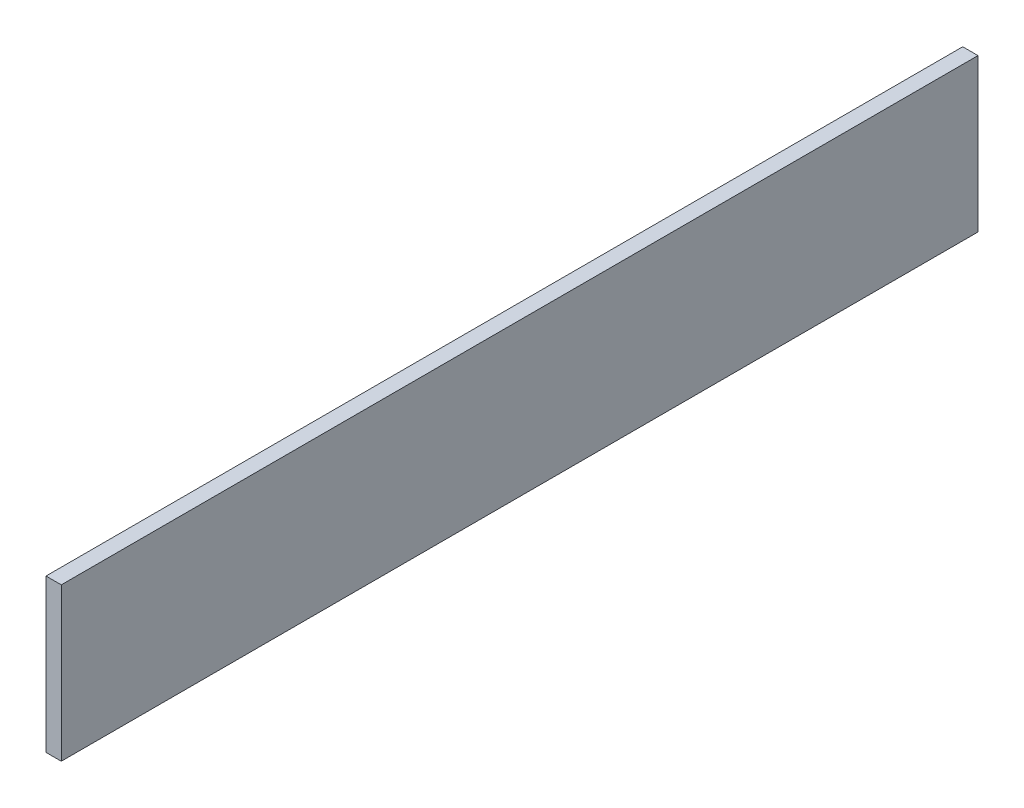
ISO-10303-21;
HEADER;
FILE_DESCRIPTION(('STEP AP214'),'2;1');
FILE_NAME('part.step','',(''),(''),'','','');
FILE_SCHEMA(('AUTOMOTIVE_DESIGN { 1 0 10303 214 1 1 1 1 }'));
ENDSEC;
DATA;
#1=APPLICATION_CONTEXT('core data for automotive mechanical design processes');
#2=APPLICATION_PROTOCOL_DEFINITION('international standard','automotive_design',2000,#1);
#3=PRODUCT_CONTEXT('',#1,'mechanical');
#4=PRODUCT('Part','Part','',(#3));
#5=PRODUCT_RELATED_PRODUCT_CATEGORY('part','',(#4));
#6=PRODUCT_DEFINITION_FORMATION('','',#4);
#7=PRODUCT_DEFINITION_CONTEXT('part definition',#1,'design');
#8=PRODUCT_DEFINITION('design','',#6,#7);
#9=PRODUCT_DEFINITION_SHAPE('','',#8);
#10=(LENGTH_UNIT() NAMED_UNIT(*) SI_UNIT(.MILLI.,.METRE.));
#11=(NAMED_UNIT(*) PLANE_ANGLE_UNIT() SI_UNIT($,.RADIAN.));
#12=(NAMED_UNIT(*) SI_UNIT($,.STERADIAN.) SOLID_ANGLE_UNIT());
#13=UNCERTAINTY_MEASURE_WITH_UNIT(LENGTH_MEASURE(1.E-05),#10,'distance_accuracy_value','');
#14=(GEOMETRIC_REPRESENTATION_CONTEXT(3) GLOBAL_UNCERTAINTY_ASSIGNED_CONTEXT((#13)) GLOBAL_UNIT_ASSIGNED_CONTEXT((#10,
#11,#12)) REPRESENTATION_CONTEXT('',''));
#15=CARTESIAN_POINT('',(0.,0.,0.));
#16=DIRECTION('',(0.,0.,1.));
#17=DIRECTION('',(1.,0.,0.));
#18=AXIS2_PLACEMENT_3D('',#15,#16,#17);
#19=CARTESIAN_POINT('',(0.,10.,0.));
#20=DIRECTION('',(1.,0.,0.));
#21=DIRECTION('',(0.,0.,-1.));
#22=AXIS2_PLACEMENT_3D('',#19,#20,#21);
#23=PLANE('',#22);
#24=DIRECTION('',(0.,0.,1.));
#25=VECTOR('',#24,1.);
#26=CARTESIAN_POINT('',(0.,0.,0.));
#27=LINE('',#26,#25);
#28=CARTESIAN_POINT('',(0.,0.,-60.));
#29=VERTEX_POINT('',#28);
#30=CARTESIAN_POINT('',(0.,0.,0.));
#31=VERTEX_POINT('',#30);
#32=EDGE_CURVE('E106',#29,#31,#27,.T.);
#33=ORIENTED_EDGE('',*,*,#32,.T.);
#34=DIRECTION('',(0.,-1.,0.));
#35=VECTOR('',#34,1.);
#36=CARTESIAN_POINT('',(0.,10.,0.));
#37=LINE('',#36,#35);
#38=CARTESIAN_POINT('',(0.,10.,0.));
#39=VERTEX_POINT('',#38);
#40=EDGE_CURVE('E11',#39,#31,#37,.T.);
#41=ORIENTED_EDGE('',*,*,#40,.F.);
#42=DIRECTION('',(0.,0.,1.));
#43=VECTOR('',#42,1.);
#44=CARTESIAN_POINT('',(0.,10.,0.));
#45=LINE('',#44,#43);
#46=CARTESIAN_POINT('',(0.,10.,-60.));
#47=VERTEX_POINT('',#46);
#48=EDGE_CURVE('E89',#47,#39,#45,.T.);
#49=ORIENTED_EDGE('',*,*,#48,.F.);
#50=DIRECTION('',(0.,-1.,0.));
#51=VECTOR('',#50,1.);
#52=CARTESIAN_POINT('',(0.,10.,-60.));
#53=LINE('',#52,#51);
#54=EDGE_CURVE('E102',#47,#29,#53,.T.);
#55=ORIENTED_EDGE('',*,*,#54,.T.);
#56=EDGE_LOOP('',(#33,#41,#49,#55));
#57=FACE_BOUND('',#56,.T.);
#58=ADVANCED_FACE('F37',(#57),#23,.F.);
#59=CARTESIAN_POINT('',(0.,10.,0.));
#60=DIRECTION('',(0.,0.,-1.));
#61=DIRECTION('',(-1.,0.,0.));
#62=AXIS2_PLACEMENT_3D('',#59,#60,#61);
#63=PLANE('',#62);
#64=DIRECTION('',(1.,0.,0.));
#65=VECTOR('',#64,1.);
#66=CARTESIAN_POINT('',(0.,0.,0.));
#67=LINE('',#66,#65);
#68=CARTESIAN_POINT('',(1.,0.,0.));
#69=VERTEX_POINT('',#68);
#70=EDGE_CURVE('E94',#31,#69,#67,.T.);
#71=ORIENTED_EDGE('',*,*,#70,.T.);
#72=DIRECTION('',(0.,-1.,0.));
#73=VECTOR('',#72,1.);
#74=CARTESIAN_POINT('',(1.,10.,0.));
#75=LINE('',#74,#73);
#76=CARTESIAN_POINT('',(1.,10.,0.));
#77=VERTEX_POINT('',#76);
#78=EDGE_CURVE('E46',#77,#69,#75,.T.);
#79=ORIENTED_EDGE('',*,*,#78,.F.);
#80=DIRECTION('',(1.,0.,0.));
#81=VECTOR('',#80,1.);
#82=CARTESIAN_POINT('',(0.,10.,0.));
#83=LINE('',#82,#81);
#84=EDGE_CURVE('E84',#39,#77,#83,.T.);
#85=ORIENTED_EDGE('',*,*,#84,.F.);
#86=ORIENTED_EDGE('',*,*,#40,.T.);
#87=EDGE_LOOP('',(#71,#79,#85,#86));
#88=FACE_BOUND('',#87,.T.);
#89=ADVANCED_FACE('F93',(#88),#63,.F.);
#90=CARTESIAN_POINT('',(1.,10.,0.));
#91=DIRECTION('',(-1.,0.,0.));
#92=DIRECTION('',(0.,0.,1.));
#93=AXIS2_PLACEMENT_3D('',#90,#91,#92);
#94=PLANE('',#93);
#95=DIRECTION('',(0.,0.,-1.));
#96=VECTOR('',#95,1.);
#97=CARTESIAN_POINT('',(1.,0.,0.));
#98=LINE('',#97,#96);
#99=CARTESIAN_POINT('',(0.999999999999989,0.,-60.));
#100=VERTEX_POINT('',#99);
#101=EDGE_CURVE('E71',#69,#100,#98,.T.);
#102=ORIENTED_EDGE('',*,*,#101,.T.);
#103=DIRECTION('',(0.,-1.,0.));
#104=VECTOR('',#103,1.);
#105=CARTESIAN_POINT('',(0.999999999999989,10.,-60.));
#106=LINE('',#105,#104);
#107=CARTESIAN_POINT('',(0.999999999999989,10.,-60.));
#108=VERTEX_POINT('',#107);
#109=EDGE_CURVE('E96',#108,#100,#106,.T.);
#110=ORIENTED_EDGE('',*,*,#109,.F.);
#111=DIRECTION('',(0.,0.,-1.));
#112=VECTOR('',#111,1.);
#113=CARTESIAN_POINT('',(1.,10.,0.));
#114=LINE('',#113,#112);
#115=EDGE_CURVE('E87',#77,#108,#114,.T.);
#116=ORIENTED_EDGE('',*,*,#115,.F.);
#117=ORIENTED_EDGE('',*,*,#78,.T.);
#118=EDGE_LOOP('',(#102,#110,#116,#117));
#119=FACE_BOUND('',#118,.T.);
#120=ADVANCED_FACE('F97',(#119),#94,.F.);
#121=CARTESIAN_POINT('',(0.,10.,-60.));
#122=DIRECTION('',(0.,0.,1.));
#123=DIRECTION('',(1.,0.,0.));
#124=AXIS2_PLACEMENT_3D('',#121,#122,#123);
#125=PLANE('',#124);
#126=DIRECTION('',(-1.,0.,0.));
#127=VECTOR('',#126,1.);
#128=CARTESIAN_POINT('',(0.,0.,-60.));
#129=LINE('',#128,#127);
#130=EDGE_CURVE('E77',#100,#29,#129,.T.);
#131=ORIENTED_EDGE('',*,*,#130,.T.);
#132=ORIENTED_EDGE('',*,*,#54,.F.);
#133=DIRECTION('',(-1.,0.,0.));
#134=VECTOR('',#133,1.);
#135=CARTESIAN_POINT('',(0.,10.,-60.));
#136=LINE('',#135,#134);
#137=EDGE_CURVE('E54',#108,#47,#136,.T.);
#138=ORIENTED_EDGE('',*,*,#137,.F.);
#139=ORIENTED_EDGE('',*,*,#109,.T.);
#140=EDGE_LOOP('',(#131,#132,#138,#139));
#141=FACE_BOUND('',#140,.T.);
#142=ADVANCED_FACE('F120',(#141),#125,.F.);
#143=CARTESIAN_POINT('',(0.,10.,0.));
#144=DIRECTION('',(0.,-1.,0.));
#145=DIRECTION('',(0.,0.,-1.));
#146=AXIS2_PLACEMENT_3D('',#143,#144,#145);
#147=PLANE('',#146);
#148=ORIENTED_EDGE('',*,*,#48,.T.);
#149=ORIENTED_EDGE('',*,*,#84,.T.);
#150=ORIENTED_EDGE('',*,*,#115,.T.);
#151=ORIENTED_EDGE('',*,*,#137,.T.);
#152=EDGE_LOOP('',(#148,#149,#150,#151));
#153=FACE_BOUND('',#152,.T.);
#154=ADVANCED_FACE('F85',(#153),#147,.F.);
#155=CARTESIAN_POINT('',(0.,0.,0.));
#156=DIRECTION('',(0.,-1.,0.));
#157=DIRECTION('',(0.,0.,-1.));
#158=AXIS2_PLACEMENT_3D('',#155,#156,#157);
#159=PLANE('',#158);
#160=ORIENTED_EDGE('',*,*,#32,.F.);
#161=ORIENTED_EDGE('',*,*,#130,.F.);
#162=ORIENTED_EDGE('',*,*,#101,.F.);
#163=ORIENTED_EDGE('',*,*,#70,.F.);
#164=EDGE_LOOP('',(#160,#161,#162,#163));
#165=FACE_BOUND('',#164,.T.);
#166=ADVANCED_FACE('F123',(#165),#159,.T.);
#167=CLOSED_SHELL('',(#58,#89,#120,#142,#154,#166));
#168=MANIFOLD_SOLID_BREP('B2',#167);
#169=ADVANCED_BREP_SHAPE_REPRESENTATION('',(#18,#168),#14);
#170=SHAPE_DEFINITION_REPRESENTATION(#9,#169);
ENDSEC;
END-ISO-10303-21;
